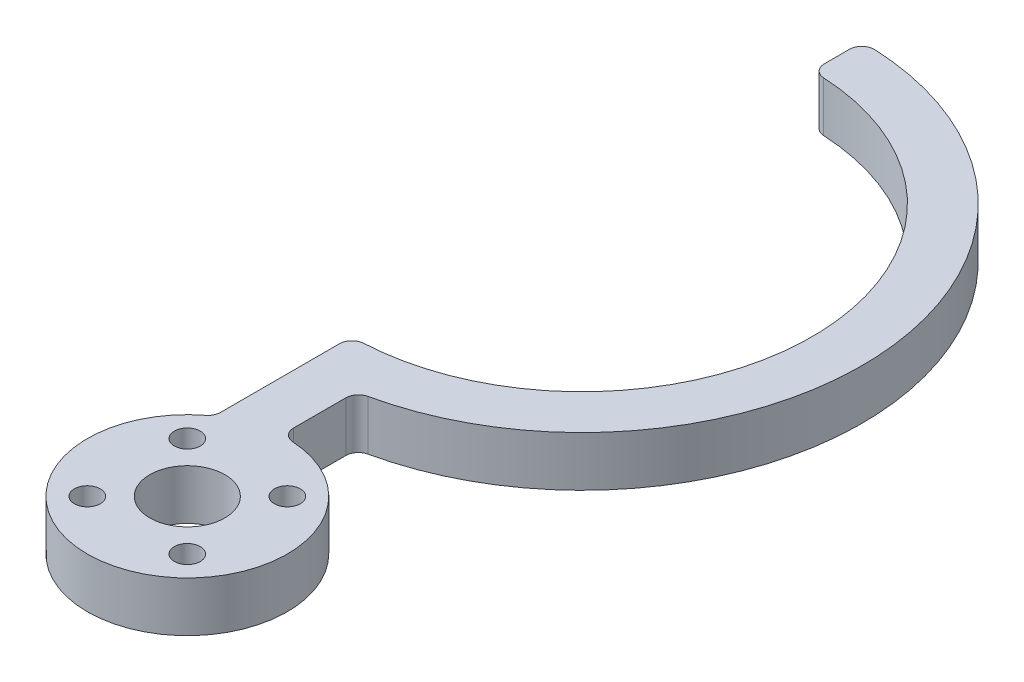
ISO-10303-21;
HEADER;
FILE_DESCRIPTION(('STEP AP214'),'2;1');
FILE_NAME('part.step','',(''),(''),'','','');
FILE_SCHEMA(('AUTOMOTIVE_DESIGN { 1 0 10303 214 1 1 1 1 }'));
ENDSEC;
DATA;
#1=APPLICATION_CONTEXT('core data for automotive mechanical design processes');
#2=APPLICATION_PROTOCOL_DEFINITION('international standard','automotive_design',2000,#1);
#3=PRODUCT_CONTEXT('',#1,'mechanical');
#4=PRODUCT('Part','Part','',(#3));
#5=PRODUCT_RELATED_PRODUCT_CATEGORY('part','',(#4));
#6=PRODUCT_DEFINITION_FORMATION('','',#4);
#7=PRODUCT_DEFINITION_CONTEXT('part definition',#1,'design');
#8=PRODUCT_DEFINITION('design','',#6,#7);
#9=PRODUCT_DEFINITION_SHAPE('','',#8);
#10=(LENGTH_UNIT() NAMED_UNIT(*) SI_UNIT(.MILLI.,.METRE.));
#11=(NAMED_UNIT(*) PLANE_ANGLE_UNIT() SI_UNIT($,.RADIAN.));
#12=(NAMED_UNIT(*) SI_UNIT($,.STERADIAN.) SOLID_ANGLE_UNIT());
#13=UNCERTAINTY_MEASURE_WITH_UNIT(LENGTH_MEASURE(1.E-05),#10,'distance_accuracy_value','');
#14=(GEOMETRIC_REPRESENTATION_CONTEXT(3) GLOBAL_UNCERTAINTY_ASSIGNED_CONTEXT((#13)) GLOBAL_UNIT_ASSIGNED_CONTEXT((#10,
#11,#12)) REPRESENTATION_CONTEXT('',''));
#15=CARTESIAN_POINT('',(0.,0.,0.));
#16=DIRECTION('',(0.,0.,1.));
#17=DIRECTION('',(1.,0.,0.));
#18=AXIS2_PLACEMENT_3D('',#15,#16,#17);
#19=CARTESIAN_POINT('',(8.96696536966746,8.,72.0811709693591));
#20=DIRECTION('',(0.,-1.,0.));
#21=DIRECTION('',(0.,0.,-1.));
#22=AXIS2_PLACEMENT_3D('',#19,#20,#21);
#23=CYLINDRICAL_SURFACE('',#22,16.);
#24=CARTESIAN_POINT('',(8.96696536966746,0.,72.0811709693591));
#25=DIRECTION('',(0.,1.,0.));
#26=DIRECTION('',(0.,0.,1.));
#27=AXIS2_PLACEMENT_3D('',#24,#25,#26);
#28=CIRCLE('',#27,16.);
#29=CARTESIAN_POINT('',(-0.781448292259167,0.,59.3938374797734));
#30=VERTEX_POINT('',#29);
#31=CARTESIAN_POINT('',(9.8852183744075,0.,56.1075423453023));
#32=VERTEX_POINT('',#31);
#33=EDGE_CURVE('E149',#30,#32,#28,.T.);
#34=ORIENTED_EDGE('',*,*,#33,.T.);
#35=DIRECTION('',(0.,-1.,0.));
#36=VECTOR('',#35,1.);
#37=CARTESIAN_POINT('',(9.8852183744075,8.,56.1075423453023));
#38=LINE('',#37,#36);
#39=CARTESIAN_POINT('',(9.8852183744075,8.,56.1075423453023));
#40=VERTEX_POINT('',#39);
#41=EDGE_CURVE('E166',#32,#40,#38,.F.);
#42=ORIENTED_EDGE('',*,*,#41,.T.);
#43=CARTESIAN_POINT('',(8.96696536966746,8.,72.0811709693591));
#44=DIRECTION('',(0.,1.,0.));
#45=DIRECTION('',(0.,0.,1.));
#46=AXIS2_PLACEMENT_3D('',#43,#44,#45);
#47=CIRCLE('',#46,16.);
#48=CARTESIAN_POINT('',(-0.781448292259167,8.,59.3938374797734));
#49=VERTEX_POINT('',#48);
#50=EDGE_CURVE('E218',#49,#40,#47,.T.);
#51=ORIENTED_EDGE('',*,*,#50,.F.);
#52=DIRECTION('',(0.,-1.,0.));
#53=VECTOR('',#52,1.);
#54=CARTESIAN_POINT('',(-0.781448292259167,8.,59.3938374797734));
#55=LINE('',#54,#53);
#56=EDGE_CURVE('E155',#49,#30,#55,.T.);
#57=ORIENTED_EDGE('',*,*,#56,.T.);
#58=EDGE_LOOP('',(#34,#42,#51,#57));
#59=FACE_BOUND('',#58,.T.);
#60=ADVANCED_FACE('F37',(#59),#23,.T.);
#61=CARTESIAN_POINT('',(8.00000000000002,8.,0.));
#62=DIRECTION('',(1.,0.,0.));
#63=DIRECTION('',(0.,0.,-1.));
#64=AXIS2_PLACEMENT_3D('',#61,#62,#63);
#65=PLANE('',#64);
#66=DIRECTION('',(0.,0.,1.));
#67=VECTOR('',#66,1.);
#68=CARTESIAN_POINT('',(8.00000000000002,8.,0.));
#69=LINE('',#68,#67);
#70=CARTESIAN_POINT('',(8.,8.,45.7498513658788));
#71=VERTEX_POINT('',#70);
#72=CARTESIAN_POINT('',(8.,8.,54.1108387672952));
#73=VERTEX_POINT('',#72);
#74=EDGE_CURVE('E222',#71,#73,#69,.T.);
#75=ORIENTED_EDGE('',*,*,#74,.T.);
#76=DIRECTION('',(0.,-1.,0.));
#77=VECTOR('',#76,1.);
#78=CARTESIAN_POINT('',(8.,8.,54.1108387672952));
#79=LINE('',#78,#77);
#80=CARTESIAN_POINT('',(8.,0.,54.1108387672952));
#81=VERTEX_POINT('',#80);
#82=EDGE_CURVE('E148',#73,#81,#79,.T.);
#83=ORIENTED_EDGE('',*,*,#82,.T.);
#84=DIRECTION('',(0.,0.,1.));
#85=VECTOR('',#84,1.);
#86=CARTESIAN_POINT('',(8.00000000000002,0.,0.));
#87=LINE('',#86,#85);
#88=CARTESIAN_POINT('',(8.,0.,45.7498513658788));
#89=VERTEX_POINT('',#88);
#90=EDGE_CURVE('E131',#89,#81,#87,.T.);
#91=ORIENTED_EDGE('',*,*,#90,.F.);
#92=DIRECTION('',(0.,-1.,0.));
#93=VECTOR('',#92,1.);
#94=CARTESIAN_POINT('',(8.,8.,45.7498513658788));
#95=LINE('',#94,#93);
#96=EDGE_CURVE('E145',#89,#71,#95,.F.);
#97=ORIENTED_EDGE('',*,*,#96,.T.);
#98=EDGE_LOOP('',(#75,#83,#91,#97));
#99=FACE_BOUND('',#98,.T.);
#100=ADVANCED_FACE('F144',(#99),#65,.T.);
#101=CARTESIAN_POINT('',(0.,8.,0.));
#102=DIRECTION('',(0.,-1.,0.));
#103=DIRECTION('',(0.,0.,-1.));
#104=AXIS2_PLACEMENT_3D('',#101,#102,#103);
#105=CYLINDRICAL_SURFACE('',#104,44.83);
#106=CARTESIAN_POINT('',(0.,8.,0.));
#107=DIRECTION('',(0.,1.,0.));
#108=DIRECTION('',(0.,0.,1.));
#109=AXIS2_PLACEMENT_3D('',#106,#107,#108);
#110=CIRCLE('',#109,44.83);
#111=CARTESIAN_POINT('',(9.57292333973949,8.,43.7959819930033));
#112=VERTEX_POINT('',#111);
#113=CARTESIAN_POINT('',(2.09339248190515,8.,-44.7810965466089));
#114=VERTEX_POINT('',#113);
#115=EDGE_CURVE('E225',#112,#114,#110,.T.);
#116=ORIENTED_EDGE('',*,*,#115,.F.);
#117=DIRECTION('',(0.,-1.,0.));
#118=VECTOR('',#117,1.);
#119=CARTESIAN_POINT('',(9.57292333973949,8.,43.7959819930033));
#120=LINE('',#119,#118);
#121=CARTESIAN_POINT('',(9.57292333973949,0.,43.7959819930033));
#122=VERTEX_POINT('',#121);
#123=EDGE_CURVE('E170',#112,#122,#120,.T.);
#124=ORIENTED_EDGE('',*,*,#123,.T.);
#125=CARTESIAN_POINT('',(0.,0.,0.));
#126=DIRECTION('',(0.,1.,0.));
#127=DIRECTION('',(0.,0.,1.));
#128=AXIS2_PLACEMENT_3D('',#125,#126,#127);
#129=CIRCLE('',#128,44.83);
#130=CARTESIAN_POINT('',(2.09339248190515,0.,-44.7810965466089));
#131=VERTEX_POINT('',#130);
#132=EDGE_CURVE('E133',#122,#131,#129,.T.);
#133=ORIENTED_EDGE('',*,*,#132,.T.);
#134=DIRECTION('',(0.,-1.,0.));
#135=VECTOR('',#134,1.);
#136=CARTESIAN_POINT('',(2.09339248190515,8.,-44.7810965466089));
#137=LINE('',#136,#135);
#138=EDGE_CURVE('E168',#131,#114,#137,.F.);
#139=ORIENTED_EDGE('',*,*,#138,.T.);
#140=EDGE_LOOP('',(#116,#124,#133,#139));
#141=FACE_BOUND('',#140,.T.);
#142=ADVANCED_FACE('F280',(#141),#105,.T.);
#143=CARTESIAN_POINT('',(0.,8.,0.));
#144=DIRECTION('',(1.,0.,0.));
#145=DIRECTION('',(0.,0.,-1.));
#146=AXIS2_PLACEMENT_3D('',#143,#144,#145);
#147=PLANE('',#146);
#148=DIRECTION('',(0.,0.,1.));
#149=VECTOR('',#148,1.);
#150=CARTESIAN_POINT('',(0.,0.,0.));
#151=LINE('',#150,#149);
#152=CARTESIAN_POINT('',(0.,0.,-42.7832782755132));
#153=VERTEX_POINT('',#152);
#154=CARTESIAN_POINT('',(0.,0.,-38.7784592267408));
#155=VERTEX_POINT('',#154);
#156=EDGE_CURVE('E254',#153,#155,#151,.T.);
#157=ORIENTED_EDGE('',*,*,#156,.T.);
#158=DIRECTION('',(0.,1.,0.));
#159=VECTOR('',#158,1.);
#160=CARTESIAN_POINT('',(0.,8.,-38.7784592267408));
#161=LINE('',#160,#159);
#162=CARTESIAN_POINT('',(0.,8.,-38.7784592267408));
#163=VERTEX_POINT('',#162);
#164=EDGE_CURVE('E52',#155,#163,#161,.T.);
#165=ORIENTED_EDGE('',*,*,#164,.T.);
#166=DIRECTION('',(0.,0.,1.));
#167=VECTOR('',#166,1.);
#168=CARTESIAN_POINT('',(0.,8.,0.));
#169=LINE('',#168,#167);
#170=CARTESIAN_POINT('',(0.,8.,-42.7832782755132));
#171=VERTEX_POINT('',#170);
#172=EDGE_CURVE('E233',#171,#163,#169,.T.);
#173=ORIENTED_EDGE('',*,*,#172,.F.);
#174=DIRECTION('',(0.,-1.,0.));
#175=VECTOR('',#174,1.);
#176=CARTESIAN_POINT('',(0.,8.,-42.7832782755132));
#177=LINE('',#176,#175);
#178=EDGE_CURVE('E193',#171,#153,#177,.T.);
#179=ORIENTED_EDGE('',*,*,#178,.T.);
#180=EDGE_LOOP('',(#157,#165,#173,#179));
#181=FACE_BOUND('',#180,.T.);
#182=ADVANCED_FACE('F377',(#181),#147,.F.);
#183=CARTESIAN_POINT('',(0.,8.,0.));
#184=DIRECTION('',(0.,-1.,0.));
#185=DIRECTION('',(0.,0.,-1.));
#186=AXIS2_PLACEMENT_3D('',#183,#184,#185);
#187=CYLINDRICAL_SURFACE('',#186,36.83);
#188=CARTESIAN_POINT('',(0.,0.,0.));
#189=DIRECTION('',(0.,1.,0.));
#190=DIRECTION('',(0.,0.,1.));
#191=AXIS2_PLACEMENT_3D('',#188,#189,#190);
#192=CIRCLE('',#191,36.83);
#193=CARTESIAN_POINT('',(1.8969868658254,0.,36.7811139150364));
#194=VERTEX_POINT('',#193);
#195=CARTESIAN_POINT('',(1.89698686582535,0.,-36.7811139150364));
#196=VERTEX_POINT('',#195);
#197=EDGE_CURVE('E211',#194,#196,#192,.T.);
#198=ORIENTED_EDGE('',*,*,#197,.F.);
#199=DIRECTION('',(0.,-1.,0.));
#200=VECTOR('',#199,1.);
#201=CARTESIAN_POINT('',(1.8969868658254,8.,36.7811139150364));
#202=LINE('',#201,#200);
#203=CARTESIAN_POINT('',(1.8969868658254,8.,36.7811139150364));
#204=VERTEX_POINT('',#203);
#205=EDGE_CURVE('E186',#194,#204,#202,.F.);
#206=ORIENTED_EDGE('',*,*,#205,.T.);
#207=CARTESIAN_POINT('',(0.,8.,0.));
#208=DIRECTION('',(0.,1.,0.));
#209=DIRECTION('',(0.,0.,1.));
#210=AXIS2_PLACEMENT_3D('',#207,#208,#209);
#211=CIRCLE('',#210,36.83);
#212=CARTESIAN_POINT('',(1.89698686582535,8.,-36.7811139150364));
#213=VERTEX_POINT('',#212);
#214=EDGE_CURVE('E158',#204,#213,#211,.T.);
#215=ORIENTED_EDGE('',*,*,#214,.T.);
#216=DIRECTION('',(0.,-1.,0.));
#217=VECTOR('',#216,1.);
#218=CARTESIAN_POINT('',(1.89698686582535,8.,-36.7811139150364));
#219=LINE('',#218,#217);
#220=EDGE_CURVE('E183',#213,#196,#219,.T.);
#221=ORIENTED_EDGE('',*,*,#220,.T.);
#222=EDGE_LOOP('',(#198,#206,#215,#221));
#223=FACE_BOUND('',#222,.T.);
#224=ADVANCED_FACE('F260',(#223),#187,.F.);
#225=CARTESIAN_POINT('',(0.966965369667458,8.,80.0811709693591));
#226=DIRECTION('',(0.,-1.,0.));
#227=DIRECTION('',(0.,0.,-1.));
#228=AXIS2_PLACEMENT_3D('',#225,#226,#227);
#229=CYLINDRICAL_SURFACE('',#228,2.07500000000001);
#230=CARTESIAN_POINT('',(0.966965369667458,8.,80.0811709693591));
#231=DIRECTION('',(0.,1.,0.));
#232=DIRECTION('',(0.,0.,1.));
#233=AXIS2_PLACEMENT_3D('',#230,#231,#232);
#234=CIRCLE('',#233,2.07500000000001);
#235=CARTESIAN_POINT('',(0.966965369667458,8.,82.1561709693591));
#236=VERTEX_POINT('',#235);
#237=EDGE_CURVE('E223',#236,#236,#234,.T.);
#238=ORIENTED_EDGE('',*,*,#237,.T.);
#239=EDGE_LOOP('',(#238));
#240=FACE_BOUND('',#239,.T.);
#241=CARTESIAN_POINT('',(0.966965369667458,0.,80.0811709693591));
#242=DIRECTION('',(0.,1.,0.));
#243=DIRECTION('',(0.,0.,1.));
#244=AXIS2_PLACEMENT_3D('',#241,#242,#243);
#245=CIRCLE('',#244,2.07500000000001);
#246=CARTESIAN_POINT('',(0.966965369667458,0.,82.1561709693591));
#247=VERTEX_POINT('',#246);
#248=EDGE_CURVE('E249',#247,#247,#245,.T.);
#249=ORIENTED_EDGE('',*,*,#248,.F.);
#250=EDGE_LOOP('',(#249));
#251=FACE_BOUND('',#250,.T.);
#252=ADVANCED_FACE('F284',(#240,#251),#229,.F.);
#253=CARTESIAN_POINT('',(16.9669653696675,8.,80.0811709693591));
#254=DIRECTION('',(0.,-1.,0.));
#255=DIRECTION('',(0.,0.,-1.));
#256=AXIS2_PLACEMENT_3D('',#253,#254,#255);
#257=CYLINDRICAL_SURFACE('',#256,2.07500000000001);
#258=CARTESIAN_POINT('',(16.9669653696675,8.,80.0811709693591));
#259=DIRECTION('',(0.,1.,0.));
#260=DIRECTION('',(0.,0.,1.));
#261=AXIS2_PLACEMENT_3D('',#258,#259,#260);
#262=CIRCLE('',#261,2.07500000000001);
#263=CARTESIAN_POINT('',(16.9669653696675,8.,82.1561709693591));
#264=VERTEX_POINT('',#263);
#265=EDGE_CURVE('E228',#264,#264,#262,.T.);
#266=ORIENTED_EDGE('',*,*,#265,.T.);
#267=EDGE_LOOP('',(#266));
#268=FACE_BOUND('',#267,.T.);
#269=CARTESIAN_POINT('',(16.9669653696675,0.,80.0811709693591));
#270=DIRECTION('',(0.,1.,0.));
#271=DIRECTION('',(0.,0.,1.));
#272=AXIS2_PLACEMENT_3D('',#269,#270,#271);
#273=CIRCLE('',#272,2.07500000000001);
#274=CARTESIAN_POINT('',(16.9669653696675,0.,82.1561709693591));
#275=VERTEX_POINT('',#274);
#276=EDGE_CURVE('E246',#275,#275,#273,.T.);
#277=ORIENTED_EDGE('',*,*,#276,.F.);
#278=EDGE_LOOP('',(#277));
#279=FACE_BOUND('',#278,.T.);
#280=ADVANCED_FACE('F287',(#268,#279),#257,.F.);
#281=CARTESIAN_POINT('',(16.9669653696675,8.,64.0811709693591));
#282=DIRECTION('',(0.,-1.,0.));
#283=DIRECTION('',(0.,0.,-1.));
#284=AXIS2_PLACEMENT_3D('',#281,#282,#283);
#285=CYLINDRICAL_SURFACE('',#284,2.075);
#286=CARTESIAN_POINT('',(16.9669653696675,8.,64.0811709693591));
#287=DIRECTION('',(0.,1.,0.));
#288=DIRECTION('',(0.,0.,1.));
#289=AXIS2_PLACEMENT_3D('',#286,#287,#288);
#290=CIRCLE('',#289,2.075);
#291=CARTESIAN_POINT('',(16.9669653696675,8.,66.1561709693591));
#292=VERTEX_POINT('',#291);
#293=EDGE_CURVE('E455',#292,#292,#290,.T.);
#294=ORIENTED_EDGE('',*,*,#293,.T.);
#295=EDGE_LOOP('',(#294));
#296=FACE_BOUND('',#295,.T.);
#297=CARTESIAN_POINT('',(16.9669653696675,0.,64.0811709693591));
#298=DIRECTION('',(0.,1.,0.));
#299=DIRECTION('',(0.,0.,1.));
#300=AXIS2_PLACEMENT_3D('',#297,#298,#299);
#301=CIRCLE('',#300,2.075);
#302=CARTESIAN_POINT('',(16.9669653696675,0.,66.1561709693591));
#303=VERTEX_POINT('',#302);
#304=EDGE_CURVE('E243',#303,#303,#301,.T.);
#305=ORIENTED_EDGE('',*,*,#304,.F.);
#306=EDGE_LOOP('',(#305));
#307=FACE_BOUND('',#306,.T.);
#308=ADVANCED_FACE('F291',(#296,#307),#285,.F.);
#309=CARTESIAN_POINT('',(0.966965369667458,8.,64.0811709693591));
#310=DIRECTION('',(0.,-1.,0.));
#311=DIRECTION('',(0.,0.,-1.));
#312=AXIS2_PLACEMENT_3D('',#309,#310,#311);
#313=CYLINDRICAL_SURFACE('',#312,2.07500000000001);
#314=CARTESIAN_POINT('',(0.966965369667458,8.,64.0811709693591));
#315=DIRECTION('',(0.,1.,0.));
#316=DIRECTION('',(0.,0.,1.));
#317=AXIS2_PLACEMENT_3D('',#314,#315,#316);
#318=CIRCLE('',#317,2.07500000000001);
#319=CARTESIAN_POINT('',(0.966965369667458,8.,66.1561709693591));
#320=VERTEX_POINT('',#319);
#321=EDGE_CURVE('E451',#320,#320,#318,.T.);
#322=ORIENTED_EDGE('',*,*,#321,.T.);
#323=EDGE_LOOP('',(#322));
#324=FACE_BOUND('',#323,.T.);
#325=CARTESIAN_POINT('',(0.966965369667458,0.,64.0811709693591));
#326=DIRECTION('',(0.,1.,0.));
#327=DIRECTION('',(0.,0.,1.));
#328=AXIS2_PLACEMENT_3D('',#325,#326,#327);
#329=CIRCLE('',#328,2.07500000000001);
#330=CARTESIAN_POINT('',(0.966965369667458,0.,66.1561709693591));
#331=VERTEX_POINT('',#330);
#332=EDGE_CURVE('E240',#331,#331,#329,.T.);
#333=ORIENTED_EDGE('',*,*,#332,.F.);
#334=EDGE_LOOP('',(#333));
#335=FACE_BOUND('',#334,.T.);
#336=ADVANCED_FACE('F295',(#324,#335),#313,.F.);
#337=CARTESIAN_POINT('',(8.96696536966746,8.,72.0811709693591));
#338=DIRECTION('',(0.,-1.,0.));
#339=DIRECTION('',(0.,0.,-1.));
#340=AXIS2_PLACEMENT_3D('',#337,#338,#339);
#341=CYLINDRICAL_SURFACE('',#340,6.00320826308857);
#342=CARTESIAN_POINT('',(8.96696536966746,8.,72.0811709693591));
#343=DIRECTION('',(0.,1.,0.));
#344=DIRECTION('',(0.,0.,1.));
#345=AXIS2_PLACEMENT_3D('',#342,#343,#344);
#346=CIRCLE('',#345,6.00320826308857);
#347=CARTESIAN_POINT('',(8.96696536966746,8.,78.0843792324477));
#348=VERTEX_POINT('',#347);
#349=EDGE_CURVE('E210',#348,#348,#346,.T.);
#350=ORIENTED_EDGE('',*,*,#349,.T.);
#351=EDGE_LOOP('',(#350));
#352=FACE_BOUND('',#351,.T.);
#353=CARTESIAN_POINT('',(8.96696536966746,0.,72.0811709693591));
#354=DIRECTION('',(0.,1.,0.));
#355=DIRECTION('',(0.,0.,1.));
#356=AXIS2_PLACEMENT_3D('',#353,#354,#355);
#357=CIRCLE('',#356,6.00320826308857);
#358=CARTESIAN_POINT('',(8.96696536966746,0.,78.0843792324477));
#359=VERTEX_POINT('',#358);
#360=EDGE_CURVE('E237',#359,#359,#357,.T.);
#361=ORIENTED_EDGE('',*,*,#360,.F.);
#362=EDGE_LOOP('',(#361));
#363=FACE_BOUND('',#362,.T.);
#364=ADVANCED_FACE('F299',(#352,#363),#341,.F.);
#365=CARTESIAN_POINT('',(0.,8.,0.));
#366=DIRECTION('',(1.,0.,0.));
#367=DIRECTION('',(0.,0.,-1.));
#368=AXIS2_PLACEMENT_3D('',#365,#366,#367);
#369=PLANE('',#368);
#370=DIRECTION('',(0.,0.,1.));
#371=VECTOR('',#370,1.);
#372=CARTESIAN_POINT('',(0.,0.,0.));
#373=LINE('',#372,#371);
#374=CARTESIAN_POINT('',(0.,0.,38.7784592267408));
#375=VERTEX_POINT('',#374);
#376=CARTESIAN_POINT('',(0.,0.,57.8079207935752));
#377=VERTEX_POINT('',#376);
#378=EDGE_CURVE('E161',#375,#377,#373,.T.);
#379=ORIENTED_EDGE('',*,*,#378,.T.);
#380=DIRECTION('',(0.,1.,0.));
#381=VECTOR('',#380,1.);
#382=CARTESIAN_POINT('',(0.,8.,57.8079207935752));
#383=LINE('',#382,#381);
#384=CARTESIAN_POINT('',(0.,8.,57.8079207935752));
#385=VERTEX_POINT('',#384);
#386=EDGE_CURVE('E175',#377,#385,#383,.T.);
#387=ORIENTED_EDGE('',*,*,#386,.T.);
#388=DIRECTION('',(0.,0.,1.));
#389=VECTOR('',#388,1.);
#390=CARTESIAN_POINT('',(0.,8.,0.));
#391=LINE('',#390,#389);
#392=CARTESIAN_POINT('',(0.,8.,38.7784592267408));
#393=VERTEX_POINT('',#392);
#394=EDGE_CURVE('E153',#393,#385,#391,.T.);
#395=ORIENTED_EDGE('',*,*,#394,.F.);
#396=DIRECTION('',(0.,1.,0.));
#397=VECTOR('',#396,1.);
#398=CARTESIAN_POINT('',(0.,0.,38.7784592267408));
#399=LINE('',#398,#397);
#400=EDGE_CURVE('E172',#393,#375,#399,.F.);
#401=ORIENTED_EDGE('',*,*,#400,.T.);
#402=EDGE_LOOP('',(#379,#387,#395,#401));
#403=FACE_BOUND('',#402,.T.);
#404=ADVANCED_FACE('F207',(#403),#369,.F.);
#405=CARTESIAN_POINT('',(0.,8.,0.));
#406=DIRECTION('',(0.,1.,0.));
#407=DIRECTION('',(0.,0.,1.));
#408=AXIS2_PLACEMENT_3D('',#405,#406,#407);
#409=PLANE('',#408);
#410=ORIENTED_EDGE('',*,*,#349,.F.);
#411=EDGE_LOOP('',(#410));
#412=FACE_BOUND('',#411,.T.);
#413=ORIENTED_EDGE('',*,*,#321,.F.);
#414=EDGE_LOOP('',(#413));
#415=FACE_BOUND('',#414,.T.);
#416=ORIENTED_EDGE('',*,*,#293,.F.);
#417=EDGE_LOOP('',(#416));
#418=FACE_BOUND('',#417,.T.);
#419=ORIENTED_EDGE('',*,*,#265,.F.);
#420=EDGE_LOOP('',(#419));
#421=FACE_BOUND('',#420,.T.);
#422=ORIENTED_EDGE('',*,*,#237,.F.);
#423=EDGE_LOOP('',(#422));
#424=FACE_BOUND('',#423,.T.);
#425=ORIENTED_EDGE('',*,*,#214,.F.);
#426=CARTESIAN_POINT('',(2.,8.,38.7784592267408));
#427=DIRECTION('',(0.,1.,0.));
#428=DIRECTION('',(0.,0.,1.));
#429=AXIS2_PLACEMENT_3D('',#426,#427,#428);
#430=CIRCLE('',#429,2.);
#431=EDGE_CURVE('E191',#204,#393,#430,.T.);
#432=ORIENTED_EDGE('',*,*,#431,.T.);
#433=ORIENTED_EDGE('',*,*,#394,.T.);
#434=CARTESIAN_POINT('',(-1.99999999999999,8.,57.8079207935752));
#435=DIRECTION('',(0.,1.,0.));
#436=DIRECTION('',(0.,0.,1.));
#437=AXIS2_PLACEMENT_3D('',#434,#435,#436);
#438=CIRCLE('',#437,2.);
#439=EDGE_CURVE('E11',#385,#49,#438,.F.);
#440=ORIENTED_EDGE('',*,*,#439,.T.);
#441=ORIENTED_EDGE('',*,*,#50,.T.);
#442=CARTESIAN_POINT('',(10.,8.,54.1108387672952));
#443=DIRECTION('',(0.,1.,0.));
#444=DIRECTION('',(0.,0.,1.));
#445=AXIS2_PLACEMENT_3D('',#442,#443,#444);
#446=CIRCLE('',#445,2.);
#447=EDGE_CURVE('E139',#40,#73,#446,.F.);
#448=ORIENTED_EDGE('',*,*,#447,.T.);
#449=ORIENTED_EDGE('',*,*,#74,.F.);
#450=CARTESIAN_POINT('',(10.,8.,45.7498513658788));
#451=DIRECTION('',(0.,1.,0.));
#452=DIRECTION('',(0.,0.,1.));
#453=AXIS2_PLACEMENT_3D('',#450,#451,#452);
#454=CIRCLE('',#453,2.);
#455=EDGE_CURVE('E138',#71,#112,#454,.F.);
#456=ORIENTED_EDGE('',*,*,#455,.T.);
#457=ORIENTED_EDGE('',*,*,#115,.T.);
#458=CARTESIAN_POINT('',(1.99999999999995,8.,-42.7832782755132));
#459=DIRECTION('',(0.,1.,0.));
#460=DIRECTION('',(0.,0.,1.));
#461=AXIS2_PLACEMENT_3D('',#458,#459,#460);
#462=CIRCLE('',#461,2.);
#463=EDGE_CURVE('E59',#114,#171,#462,.T.);
#464=ORIENTED_EDGE('',*,*,#463,.T.);
#465=ORIENTED_EDGE('',*,*,#172,.T.);
#466=CARTESIAN_POINT('',(1.99999999999995,8.,-38.7784592267408));
#467=DIRECTION('',(0.,1.,0.));
#468=DIRECTION('',(0.,0.,1.));
#469=AXIS2_PLACEMENT_3D('',#466,#467,#468);
#470=CIRCLE('',#469,2.);
#471=EDGE_CURVE('E189',#163,#213,#470,.T.);
#472=ORIENTED_EDGE('',*,*,#471,.T.);
#473=EDGE_LOOP('',(#425,#432,#433,#440,#441,#448,#449,#456,#457,#464,#465,#472));
#474=FACE_BOUND('',#473,.T.);
#475=ADVANCED_FACE('F217',(#412,#415,#418,#421,#424,#474),#409,.T.);
#476=CARTESIAN_POINT('',(0.,0.,0.));
#477=DIRECTION('',(0.,1.,0.));
#478=DIRECTION('',(0.,0.,1.));
#479=AXIS2_PLACEMENT_3D('',#476,#477,#478);
#480=PLANE('',#479);
#481=ORIENTED_EDGE('',*,*,#360,.T.);
#482=EDGE_LOOP('',(#481));
#483=FACE_BOUND('',#482,.T.);
#484=ORIENTED_EDGE('',*,*,#332,.T.);
#485=EDGE_LOOP('',(#484));
#486=FACE_BOUND('',#485,.T.);
#487=ORIENTED_EDGE('',*,*,#304,.T.);
#488=EDGE_LOOP('',(#487));
#489=FACE_BOUND('',#488,.T.);
#490=ORIENTED_EDGE('',*,*,#276,.T.);
#491=EDGE_LOOP('',(#490));
#492=FACE_BOUND('',#491,.T.);
#493=ORIENTED_EDGE('',*,*,#248,.T.);
#494=EDGE_LOOP('',(#493));
#495=FACE_BOUND('',#494,.T.);
#496=ORIENTED_EDGE('',*,*,#378,.F.);
#497=CARTESIAN_POINT('',(2.,0.,38.7784592267408));
#498=DIRECTION('',(0.,1.,0.));
#499=DIRECTION('',(0.,0.,1.));
#500=AXIS2_PLACEMENT_3D('',#497,#498,#499);
#501=CIRCLE('',#500,2.);
#502=EDGE_CURVE('E181',#375,#194,#501,.F.);
#503=ORIENTED_EDGE('',*,*,#502,.T.);
#504=ORIENTED_EDGE('',*,*,#197,.T.);
#505=CARTESIAN_POINT('',(1.99999999999995,0.,-38.7784592267408));
#506=DIRECTION('',(0.,1.,0.));
#507=DIRECTION('',(0.,0.,1.));
#508=AXIS2_PLACEMENT_3D('',#505,#506,#507);
#509=CIRCLE('',#508,2.);
#510=EDGE_CURVE('E179',#196,#155,#509,.F.);
#511=ORIENTED_EDGE('',*,*,#510,.T.);
#512=ORIENTED_EDGE('',*,*,#156,.F.);
#513=CARTESIAN_POINT('',(1.99999999999995,0.,-42.7832782755132));
#514=DIRECTION('',(0.,1.,0.));
#515=DIRECTION('',(0.,0.,1.));
#516=AXIS2_PLACEMENT_3D('',#513,#514,#515);
#517=CIRCLE('',#516,2.);
#518=EDGE_CURVE('E177',#153,#131,#517,.F.);
#519=ORIENTED_EDGE('',*,*,#518,.T.);
#520=ORIENTED_EDGE('',*,*,#132,.F.);
#521=CARTESIAN_POINT('',(10.,0.,45.7498513658788));
#522=DIRECTION('',(0.,1.,0.));
#523=DIRECTION('',(0.,0.,1.));
#524=AXIS2_PLACEMENT_3D('',#521,#522,#523);
#525=CIRCLE('',#524,2.);
#526=EDGE_CURVE('E127',#122,#89,#525,.T.);
#527=ORIENTED_EDGE('',*,*,#526,.T.);
#528=ORIENTED_EDGE('',*,*,#90,.T.);
#529=CARTESIAN_POINT('',(10.,0.,54.1108387672952));
#530=DIRECTION('',(0.,1.,0.));
#531=DIRECTION('',(0.,0.,1.));
#532=AXIS2_PLACEMENT_3D('',#529,#530,#531);
#533=CIRCLE('',#532,2.);
#534=EDGE_CURVE('E197',#81,#32,#533,.T.);
#535=ORIENTED_EDGE('',*,*,#534,.T.);
#536=ORIENTED_EDGE('',*,*,#33,.F.);
#537=CARTESIAN_POINT('',(-1.99999999999999,0.,57.8079207935752));
#538=DIRECTION('',(0.,1.,0.));
#539=DIRECTION('',(0.,0.,1.));
#540=AXIS2_PLACEMENT_3D('',#537,#538,#539);
#541=CIRCLE('',#540,2.);
#542=EDGE_CURVE('E45',#30,#377,#541,.T.);
#543=ORIENTED_EDGE('',*,*,#542,.T.);
#544=EDGE_LOOP('',(#496,#503,#504,#511,#512,#519,#520,#527,#528,#535,#536,#543));
#545=FACE_BOUND('',#544,.T.);
#546=ADVANCED_FACE('F130',(#483,#486,#489,#492,#495,#545),#480,.F.);
#547=CARTESIAN_POINT('',(10.,8.,54.1108387672952));
#548=DIRECTION('',(0.,-1.,0.));
#549=DIRECTION('',(0.,0.,-1.));
#550=AXIS2_PLACEMENT_3D('',#547,#548,#549);
#551=CYLINDRICAL_SURFACE('',#550,2.);
#552=ORIENTED_EDGE('',*,*,#447,.F.);
#553=ORIENTED_EDGE('',*,*,#41,.F.);
#554=ORIENTED_EDGE('',*,*,#534,.F.);
#555=ORIENTED_EDGE('',*,*,#82,.F.);
#556=EDGE_LOOP('',(#552,#553,#554,#555));
#557=FACE_BOUND('',#556,.T.);
#558=ADVANCED_FACE('F304',(#557),#551,.F.);
#559=CARTESIAN_POINT('',(10.,8.,45.7498513658788));
#560=DIRECTION('',(0.,-1.,0.));
#561=DIRECTION('',(0.,0.,-1.));
#562=AXIS2_PLACEMENT_3D('',#559,#560,#561);
#563=CYLINDRICAL_SURFACE('',#562,2.);
#564=ORIENTED_EDGE('',*,*,#455,.F.);
#565=ORIENTED_EDGE('',*,*,#96,.F.);
#566=ORIENTED_EDGE('',*,*,#526,.F.);
#567=ORIENTED_EDGE('',*,*,#123,.F.);
#568=EDGE_LOOP('',(#564,#565,#566,#567));
#569=FACE_BOUND('',#568,.T.);
#570=ADVANCED_FACE('F152',(#569),#563,.F.);
#571=CARTESIAN_POINT('',(-1.99999999999999,8.,57.8079207935752));
#572=DIRECTION('',(0.,-1.,0.));
#573=DIRECTION('',(0.,0.,-1.));
#574=AXIS2_PLACEMENT_3D('',#571,#572,#573);
#575=CYLINDRICAL_SURFACE('',#574,2.);
#576=ORIENTED_EDGE('',*,*,#439,.F.);
#577=ORIENTED_EDGE('',*,*,#386,.F.);
#578=ORIENTED_EDGE('',*,*,#542,.F.);
#579=ORIENTED_EDGE('',*,*,#56,.F.);
#580=EDGE_LOOP('',(#576,#577,#578,#579));
#581=FACE_BOUND('',#580,.T.);
#582=ADVANCED_FACE('F213',(#581),#575,.F.);
#583=CARTESIAN_POINT('',(2.,8.,38.7784592267408));
#584=DIRECTION('',(0.,-1.,0.));
#585=DIRECTION('',(0.,0.,-1.));
#586=AXIS2_PLACEMENT_3D('',#583,#584,#585);
#587=CYLINDRICAL_SURFACE('',#586,2.);
#588=ORIENTED_EDGE('',*,*,#431,.F.);
#589=ORIENTED_EDGE('',*,*,#205,.F.);
#590=ORIENTED_EDGE('',*,*,#502,.F.);
#591=ORIENTED_EDGE('',*,*,#400,.F.);
#592=EDGE_LOOP('',(#588,#589,#590,#591));
#593=FACE_BOUND('',#592,.T.);
#594=ADVANCED_FACE('F264',(#593),#587,.T.);
#595=CARTESIAN_POINT('',(1.99999999999995,8.,-38.7784592267408));
#596=DIRECTION('',(0.,-1.,0.));
#597=DIRECTION('',(0.,0.,-1.));
#598=AXIS2_PLACEMENT_3D('',#595,#596,#597);
#599=CYLINDRICAL_SURFACE('',#598,2.);
#600=ORIENTED_EDGE('',*,*,#471,.F.);
#601=ORIENTED_EDGE('',*,*,#164,.F.);
#602=ORIENTED_EDGE('',*,*,#510,.F.);
#603=ORIENTED_EDGE('',*,*,#220,.F.);
#604=EDGE_LOOP('',(#600,#601,#602,#603));
#605=FACE_BOUND('',#604,.T.);
#606=ADVANCED_FACE('F267',(#605),#599,.T.);
#607=CARTESIAN_POINT('',(1.99999999999995,8.,-42.7832782755132));
#608=DIRECTION('',(0.,-1.,0.));
#609=DIRECTION('',(0.,0.,-1.));
#610=AXIS2_PLACEMENT_3D('',#607,#608,#609);
#611=CYLINDRICAL_SURFACE('',#610,2.);
#612=ORIENTED_EDGE('',*,*,#463,.F.);
#613=ORIENTED_EDGE('',*,*,#138,.F.);
#614=ORIENTED_EDGE('',*,*,#518,.F.);
#615=ORIENTED_EDGE('',*,*,#178,.F.);
#616=EDGE_LOOP('',(#612,#613,#614,#615));
#617=FACE_BOUND('',#616,.T.);
#618=ADVANCED_FACE('F39',(#617),#611,.T.);
#619=CLOSED_SHELL('',(#60,#100,#142,#182,#224,#252,#280,#308,#336,#364,#404,#475,#546,#558,#570,
#582,#594,#606,#618));
#620=MANIFOLD_SOLID_BREP('B2',#619);
#621=ADVANCED_BREP_SHAPE_REPRESENTATION('',(#18,#620),#14);
#622=SHAPE_DEFINITION_REPRESENTATION(#9,#621);
ENDSEC;
END-ISO-10303-21;
